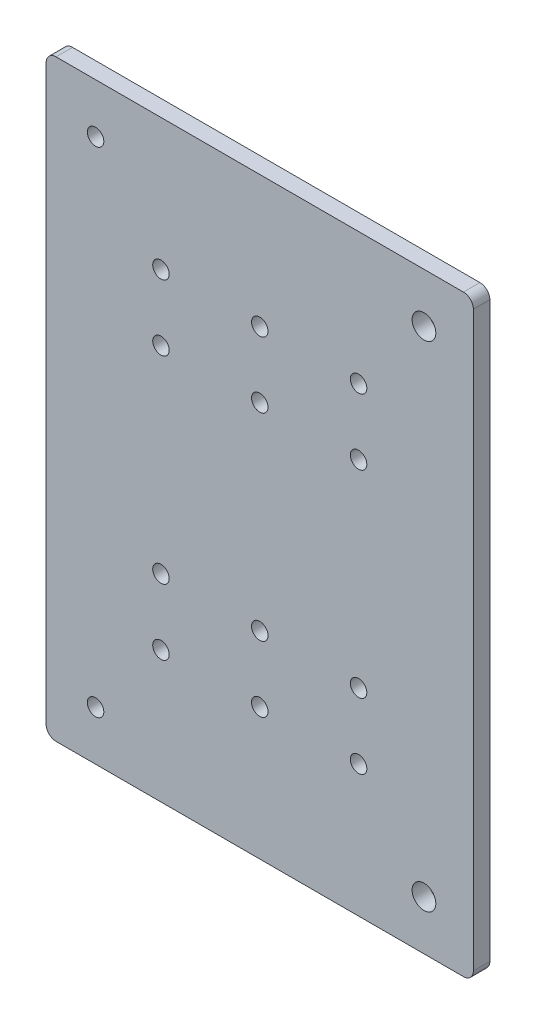
ISO-10303-21;
HEADER;
FILE_DESCRIPTION(('STEP AP214'),'2;1');
FILE_NAME('part.step','',(''),(''),'','','');
FILE_SCHEMA(('AUTOMOTIVE_DESIGN { 1 0 10303 214 1 1 1 1 }'));
ENDSEC;
DATA;
#1=APPLICATION_CONTEXT('core data for automotive mechanical design processes');
#2=APPLICATION_PROTOCOL_DEFINITION('international standard','automotive_design',2000,#1);
#3=PRODUCT_CONTEXT('',#1,'mechanical');
#4=PRODUCT('Part','Part','',(#3));
#5=PRODUCT_RELATED_PRODUCT_CATEGORY('part','',(#4));
#6=PRODUCT_DEFINITION_FORMATION('','',#4);
#7=PRODUCT_DEFINITION_CONTEXT('part definition',#1,'design');
#8=PRODUCT_DEFINITION('design','',#6,#7);
#9=PRODUCT_DEFINITION_SHAPE('','',#8);
#10=(LENGTH_UNIT() NAMED_UNIT(*) SI_UNIT(.MILLI.,.METRE.));
#11=(NAMED_UNIT(*) PLANE_ANGLE_UNIT() SI_UNIT($,.RADIAN.));
#12=(NAMED_UNIT(*) SI_UNIT($,.STERADIAN.) SOLID_ANGLE_UNIT());
#13=UNCERTAINTY_MEASURE_WITH_UNIT(LENGTH_MEASURE(1.E-05),#10,'distance_accuracy_value','');
#14=(GEOMETRIC_REPRESENTATION_CONTEXT(3) GLOBAL_UNCERTAINTY_ASSIGNED_CONTEXT((#13)) GLOBAL_UNIT_ASSIGNED_CONTEXT((#10,
#11,#12)) REPRESENTATION_CONTEXT('',''));
#15=CARTESIAN_POINT('',(0.,0.,0.));
#16=DIRECTION('',(0.,0.,1.));
#17=DIRECTION('',(1.,0.,0.));
#18=AXIS2_PLACEMENT_3D('',#15,#16,#17);
#19=CARTESIAN_POINT('',(0.,0.,5.));
#20=DIRECTION('',(0.,0.,-1.));
#21=DIRECTION('',(-1.,0.,0.));
#22=AXIS2_PLACEMENT_3D('',#19,#20,#21);
#23=PLANE('',#22);
#24=DIRECTION('',(0.,-1.,0.));
#25=VECTOR('',#24,1.);
#26=CARTESIAN_POINT('',(0.,0.,5.));
#27=LINE('',#26,#25);
#28=CARTESIAN_POINT('',(0.,177.,5.));
#29=VERTEX_POINT('',#28);
#30=CARTESIAN_POINT('',(0.,3.,5.));
#31=VERTEX_POINT('',#30);
#32=EDGE_CURVE('E155',#29,#31,#27,.T.);
#33=ORIENTED_EDGE('',*,*,#32,.T.);
#34=CARTESIAN_POINT('',(3.,3.,5.));
#35=DIRECTION('',(0.,0.,-1.));
#36=DIRECTION('',(-1.,0.,0.));
#37=AXIS2_PLACEMENT_3D('',#34,#35,#36);
#38=CIRCLE('',#37,3.);
#39=CARTESIAN_POINT('',(3.,0.,5.));
#40=VERTEX_POINT('',#39);
#41=EDGE_CURVE('E179',#31,#40,#38,.F.);
#42=ORIENTED_EDGE('',*,*,#41,.T.);
#43=DIRECTION('',(1.,0.,0.));
#44=VECTOR('',#43,1.);
#45=CARTESIAN_POINT('',(0.,0.,5.));
#46=LINE('',#45,#44);
#47=CARTESIAN_POINT('',(126.7,0.,5.));
#48=VERTEX_POINT('',#47);
#49=EDGE_CURVE('E130',#40,#48,#46,.T.);
#50=ORIENTED_EDGE('',*,*,#49,.T.);
#51=CARTESIAN_POINT('',(126.7,3.,5.));
#52=DIRECTION('',(0.,0.,-1.));
#53=DIRECTION('',(-1.,0.,0.));
#54=AXIS2_PLACEMENT_3D('',#51,#52,#53);
#55=CIRCLE('',#54,3.);
#56=CARTESIAN_POINT('',(129.7,3.,5.));
#57=VERTEX_POINT('',#56);
#58=EDGE_CURVE('E176',#48,#57,#55,.F.);
#59=ORIENTED_EDGE('',*,*,#58,.T.);
#60=DIRECTION('',(0.,1.,0.));
#61=VECTOR('',#60,1.);
#62=CARTESIAN_POINT('',(129.7,0.,5.));
#63=LINE('',#62,#61);
#64=CARTESIAN_POINT('',(129.7,177.,5.));
#65=VERTEX_POINT('',#64);
#66=EDGE_CURVE('E209',#57,#65,#63,.T.);
#67=ORIENTED_EDGE('',*,*,#66,.T.);
#68=CARTESIAN_POINT('',(126.7,177.,5.));
#69=DIRECTION('',(0.,0.,-1.));
#70=DIRECTION('',(-1.,0.,0.));
#71=AXIS2_PLACEMENT_3D('',#68,#69,#70);
#72=CIRCLE('',#71,3.);
#73=CARTESIAN_POINT('',(126.7,180.,5.));
#74=VERTEX_POINT('',#73);
#75=EDGE_CURVE('E64',#65,#74,#72,.F.);
#76=ORIENTED_EDGE('',*,*,#75,.T.);
#77=DIRECTION('',(-1.,0.,0.));
#78=VECTOR('',#77,1.);
#79=CARTESIAN_POINT('',(0.,180.,5.));
#80=LINE('',#79,#78);
#81=CARTESIAN_POINT('',(3.,180.,5.));
#82=VERTEX_POINT('',#81);
#83=EDGE_CURVE('E157',#74,#82,#80,.T.);
#84=ORIENTED_EDGE('',*,*,#83,.T.);
#85=CARTESIAN_POINT('',(3.,177.,5.));
#86=DIRECTION('',(0.,0.,-1.));
#87=DIRECTION('',(-1.,0.,0.));
#88=AXIS2_PLACEMENT_3D('',#85,#86,#87);
#89=CIRCLE('',#88,3.);
#90=EDGE_CURVE('E173',#82,#29,#89,.F.);
#91=ORIENTED_EDGE('',*,*,#90,.T.);
#92=EDGE_LOOP('',(#33,#42,#50,#59,#67,#76,#84,#91));
#93=FACE_BOUND('',#92,.T.);
#94=CARTESIAN_POINT('',(15.,15.,5.));
#95=DIRECTION('',(0.,0.,1.));
#96=DIRECTION('',(1.,0.,0.));
#97=AXIS2_PLACEMENT_3D('',#94,#95,#96);
#98=CIRCLE('',#97,2.5);
#99=CARTESIAN_POINT('',(17.5,15.,5.));
#100=VERTEX_POINT('',#99);
#101=EDGE_CURVE('E149',#100,#100,#98,.T.);
#102=ORIENTED_EDGE('',*,*,#101,.F.);
#103=EDGE_LOOP('',(#102));
#104=FACE_BOUND('',#103,.T.);
#105=CARTESIAN_POINT('',(15.,165.,5.));
#106=DIRECTION('',(0.,0.,1.));
#107=DIRECTION('',(1.,0.,0.));
#108=AXIS2_PLACEMENT_3D('',#105,#106,#107);
#109=CIRCLE('',#108,2.5);
#110=CARTESIAN_POINT('',(17.5,165.,5.));
#111=VERTEX_POINT('',#110);
#112=EDGE_CURVE('E228',#111,#111,#109,.T.);
#113=ORIENTED_EDGE('',*,*,#112,.F.);
#114=EDGE_LOOP('',(#113));
#115=FACE_BOUND('',#114,.T.);
#116=CARTESIAN_POINT('',(114.7,165.,5.));
#117=DIRECTION('',(0.,0.,1.));
#118=DIRECTION('',(1.,0.,0.));
#119=AXIS2_PLACEMENT_3D('',#116,#117,#118);
#120=CIRCLE('',#119,3.59999999999997);
#121=CARTESIAN_POINT('',(118.3,165.,5.));
#122=VERTEX_POINT('',#121);
#123=EDGE_CURVE('E232',#122,#122,#120,.T.);
#124=ORIENTED_EDGE('',*,*,#123,.F.);
#125=EDGE_LOOP('',(#124));
#126=FACE_BOUND('',#125,.T.);
#127=CARTESIAN_POINT('',(114.7,15.,5.));
#128=DIRECTION('',(0.,0.,1.));
#129=DIRECTION('',(1.,0.,0.));
#130=AXIS2_PLACEMENT_3D('',#127,#128,#129);
#131=CIRCLE('',#130,3.6);
#132=CARTESIAN_POINT('',(118.3,15.,5.));
#133=VERTEX_POINT('',#132);
#134=EDGE_CURVE('E236',#133,#133,#131,.T.);
#135=ORIENTED_EDGE('',*,*,#134,.F.);
#136=EDGE_LOOP('',(#135));
#137=FACE_BOUND('',#136,.T.);
#138=CARTESIAN_POINT('',(34.85,140.,5.));
#139=DIRECTION('',(0.,0.,1.));
#140=DIRECTION('',(1.,0.,0.));
#141=AXIS2_PLACEMENT_3D('',#138,#139,#140);
#142=CIRCLE('',#141,2.5);
#143=CARTESIAN_POINT('',(37.35,140.,5.));
#144=VERTEX_POINT('',#143);
#145=EDGE_CURVE('E240',#144,#144,#142,.T.);
#146=ORIENTED_EDGE('',*,*,#145,.F.);
#147=EDGE_LOOP('',(#146));
#148=FACE_BOUND('',#147,.T.);
#149=CARTESIAN_POINT('',(64.85,140.,5.));
#150=DIRECTION('',(0.,0.,1.));
#151=DIRECTION('',(1.,0.,0.));
#152=AXIS2_PLACEMENT_3D('',#149,#150,#151);
#153=CIRCLE('',#152,2.5);
#154=CARTESIAN_POINT('',(67.35,140.,5.));
#155=VERTEX_POINT('',#154);
#156=EDGE_CURVE('E244',#155,#155,#153,.T.);
#157=ORIENTED_EDGE('',*,*,#156,.F.);
#158=EDGE_LOOP('',(#157));
#159=FACE_BOUND('',#158,.T.);
#160=CARTESIAN_POINT('',(94.85,140.,5.));
#161=DIRECTION('',(0.,0.,1.));
#162=DIRECTION('',(1.,0.,0.));
#163=AXIS2_PLACEMENT_3D('',#160,#161,#162);
#164=CIRCLE('',#163,2.5);
#165=CARTESIAN_POINT('',(97.35,140.,5.));
#166=VERTEX_POINT('',#165);
#167=EDGE_CURVE('E248',#166,#166,#164,.T.);
#168=ORIENTED_EDGE('',*,*,#167,.F.);
#169=EDGE_LOOP('',(#168));
#170=FACE_BOUND('',#169,.T.);
#171=CARTESIAN_POINT('',(34.85,40.,5.));
#172=DIRECTION('',(0.,0.,1.));
#173=DIRECTION('',(1.,0.,0.));
#174=AXIS2_PLACEMENT_3D('',#171,#172,#173);
#175=CIRCLE('',#174,2.5);
#176=CARTESIAN_POINT('',(37.35,40.,5.));
#177=VERTEX_POINT('',#176);
#178=EDGE_CURVE('E252',#177,#177,#175,.T.);
#179=ORIENTED_EDGE('',*,*,#178,.F.);
#180=EDGE_LOOP('',(#179));
#181=FACE_BOUND('',#180,.T.);
#182=CARTESIAN_POINT('',(64.85,40.,5.));
#183=DIRECTION('',(0.,0.,1.));
#184=DIRECTION('',(1.,0.,0.));
#185=AXIS2_PLACEMENT_3D('',#182,#183,#184);
#186=CIRCLE('',#185,2.5);
#187=CARTESIAN_POINT('',(67.35,40.,5.));
#188=VERTEX_POINT('',#187);
#189=EDGE_CURVE('E256',#188,#188,#186,.T.);
#190=ORIENTED_EDGE('',*,*,#189,.F.);
#191=EDGE_LOOP('',(#190));
#192=FACE_BOUND('',#191,.T.);
#193=CARTESIAN_POINT('',(94.85,40.,5.));
#194=DIRECTION('',(0.,0.,1.));
#195=DIRECTION('',(1.,0.,0.));
#196=AXIS2_PLACEMENT_3D('',#193,#194,#195);
#197=CIRCLE('',#196,2.5);
#198=CARTESIAN_POINT('',(97.35,40.,5.));
#199=VERTEX_POINT('',#198);
#200=EDGE_CURVE('E260',#199,#199,#197,.T.);
#201=ORIENTED_EDGE('',*,*,#200,.F.);
#202=EDGE_LOOP('',(#201));
#203=FACE_BOUND('',#202,.T.);
#204=CARTESIAN_POINT('',(94.85,120.,5.));
#205=DIRECTION('',(0.,0.,1.));
#206=DIRECTION('',(1.,0.,0.));
#207=AXIS2_PLACEMENT_3D('',#204,#205,#206);
#208=CIRCLE('',#207,2.5);
#209=CARTESIAN_POINT('',(97.35,120.,5.));
#210=VERTEX_POINT('',#209);
#211=EDGE_CURVE('E264',#210,#210,#208,.T.);
#212=ORIENTED_EDGE('',*,*,#211,.F.);
#213=EDGE_LOOP('',(#212));
#214=FACE_BOUND('',#213,.T.);
#215=CARTESIAN_POINT('',(64.85,120.,5.));
#216=DIRECTION('',(0.,0.,1.));
#217=DIRECTION('',(1.,0.,0.));
#218=AXIS2_PLACEMENT_3D('',#215,#216,#217);
#219=CIRCLE('',#218,2.5);
#220=CARTESIAN_POINT('',(67.35,120.,5.));
#221=VERTEX_POINT('',#220);
#222=EDGE_CURVE('E268',#221,#221,#219,.T.);
#223=ORIENTED_EDGE('',*,*,#222,.F.);
#224=EDGE_LOOP('',(#223));
#225=FACE_BOUND('',#224,.T.);
#226=CARTESIAN_POINT('',(34.85,120.,5.));
#227=DIRECTION('',(0.,0.,1.));
#228=DIRECTION('',(1.,0.,0.));
#229=AXIS2_PLACEMENT_3D('',#226,#227,#228);
#230=CIRCLE('',#229,2.5);
#231=CARTESIAN_POINT('',(37.35,120.,5.));
#232=VERTEX_POINT('',#231);
#233=EDGE_CURVE('E272',#232,#232,#230,.T.);
#234=ORIENTED_EDGE('',*,*,#233,.F.);
#235=EDGE_LOOP('',(#234));
#236=FACE_BOUND('',#235,.T.);
#237=CARTESIAN_POINT('',(34.85,60.,5.));
#238=DIRECTION('',(0.,0.,1.));
#239=DIRECTION('',(1.,0.,0.));
#240=AXIS2_PLACEMENT_3D('',#237,#238,#239);
#241=CIRCLE('',#240,2.5);
#242=CARTESIAN_POINT('',(37.35,60.,5.));
#243=VERTEX_POINT('',#242);
#244=EDGE_CURVE('E276',#243,#243,#241,.T.);
#245=ORIENTED_EDGE('',*,*,#244,.F.);
#246=EDGE_LOOP('',(#245));
#247=FACE_BOUND('',#246,.T.);
#248=CARTESIAN_POINT('',(64.85,60.,5.));
#249=DIRECTION('',(0.,0.,1.));
#250=DIRECTION('',(1.,0.,0.));
#251=AXIS2_PLACEMENT_3D('',#248,#249,#250);
#252=CIRCLE('',#251,2.5);
#253=CARTESIAN_POINT('',(67.35,60.,5.));
#254=VERTEX_POINT('',#253);
#255=EDGE_CURVE('E280',#254,#254,#252,.T.);
#256=ORIENTED_EDGE('',*,*,#255,.F.);
#257=EDGE_LOOP('',(#256));
#258=FACE_BOUND('',#257,.T.);
#259=CARTESIAN_POINT('',(94.85,60.,5.));
#260=DIRECTION('',(0.,0.,1.));
#261=DIRECTION('',(1.,0.,0.));
#262=AXIS2_PLACEMENT_3D('',#259,#260,#261);
#263=CIRCLE('',#262,2.5);
#264=CARTESIAN_POINT('',(97.35,60.,5.));
#265=VERTEX_POINT('',#264);
#266=EDGE_CURVE('E283',#265,#265,#263,.T.);
#267=ORIENTED_EDGE('',*,*,#266,.F.);
#268=EDGE_LOOP('',(#267));
#269=FACE_BOUND('',#268,.T.);
#270=ADVANCED_FACE('F43',(#93,#104,#115,#126,#137,#148,#159,#170,#181,#192,#203,#214,#225,#236,
#247,#258,#269),#23,.F.);
#271=CARTESIAN_POINT('',(0.,0.,0.));
#272=DIRECTION('',(0.,0.,-1.));
#273=DIRECTION('',(-1.,0.,0.));
#274=AXIS2_PLACEMENT_3D('',#271,#272,#273);
#275=PLANE('',#274);
#276=CARTESIAN_POINT('',(64.85,60.,0.));
#277=DIRECTION('',(0.,0.,1.));
#278=DIRECTION('',(1.,0.,0.));
#279=AXIS2_PLACEMENT_3D('',#276,#277,#278);
#280=CIRCLE('',#279,2.5);
#281=CARTESIAN_POINT('',(67.35,60.,0.));
#282=VERTEX_POINT('',#281);
#283=EDGE_CURVE('E286',#282,#282,#280,.T.);
#284=ORIENTED_EDGE('',*,*,#283,.T.);
#285=EDGE_LOOP('',(#284));
#286=FACE_BOUND('',#285,.T.);
#287=CARTESIAN_POINT('',(34.85,120.,0.));
#288=DIRECTION('',(0.,0.,1.));
#289=DIRECTION('',(1.,0.,0.));
#290=AXIS2_PLACEMENT_3D('',#287,#288,#289);
#291=CIRCLE('',#290,2.5);
#292=CARTESIAN_POINT('',(37.35,120.,0.));
#293=VERTEX_POINT('',#292);
#294=EDGE_CURVE('E303',#293,#293,#291,.T.);
#295=ORIENTED_EDGE('',*,*,#294,.T.);
#296=EDGE_LOOP('',(#295));
#297=FACE_BOUND('',#296,.T.);
#298=CARTESIAN_POINT('',(94.85,120.,0.));
#299=DIRECTION('',(0.,0.,1.));
#300=DIRECTION('',(1.,0.,0.));
#301=AXIS2_PLACEMENT_3D('',#298,#299,#300);
#302=CIRCLE('',#301,2.5);
#303=CARTESIAN_POINT('',(97.35,120.,0.));
#304=VERTEX_POINT('',#303);
#305=EDGE_CURVE('E315',#304,#304,#302,.T.);
#306=ORIENTED_EDGE('',*,*,#305,.T.);
#307=EDGE_LOOP('',(#306));
#308=FACE_BOUND('',#307,.T.);
#309=CARTESIAN_POINT('',(64.85,40.,0.));
#310=DIRECTION('',(0.,0.,1.));
#311=DIRECTION('',(1.,0.,0.));
#312=AXIS2_PLACEMENT_3D('',#309,#310,#311);
#313=CIRCLE('',#312,2.5);
#314=CARTESIAN_POINT('',(67.35,40.,0.));
#315=VERTEX_POINT('',#314);
#316=EDGE_CURVE('E327',#315,#315,#313,.T.);
#317=ORIENTED_EDGE('',*,*,#316,.T.);
#318=EDGE_LOOP('',(#317));
#319=FACE_BOUND('',#318,.T.);
#320=CARTESIAN_POINT('',(94.85,140.,0.));
#321=DIRECTION('',(0.,0.,1.));
#322=DIRECTION('',(1.,0.,0.));
#323=AXIS2_PLACEMENT_3D('',#320,#321,#322);
#324=CIRCLE('',#323,2.5);
#325=CARTESIAN_POINT('',(97.35,140.,0.));
#326=VERTEX_POINT('',#325);
#327=EDGE_CURVE('E339',#326,#326,#324,.T.);
#328=ORIENTED_EDGE('',*,*,#327,.T.);
#329=EDGE_LOOP('',(#328));
#330=FACE_BOUND('',#329,.T.);
#331=CARTESIAN_POINT('',(34.85,140.,0.));
#332=DIRECTION('',(0.,0.,1.));
#333=DIRECTION('',(1.,0.,0.));
#334=AXIS2_PLACEMENT_3D('',#331,#332,#333);
#335=CIRCLE('',#334,2.5);
#336=CARTESIAN_POINT('',(37.35,140.,0.));
#337=VERTEX_POINT('',#336);
#338=EDGE_CURVE('E351',#337,#337,#335,.T.);
#339=ORIENTED_EDGE('',*,*,#338,.T.);
#340=EDGE_LOOP('',(#339));
#341=FACE_BOUND('',#340,.T.);
#342=CARTESIAN_POINT('',(114.7,165.,0.));
#343=DIRECTION('',(0.,0.,1.));
#344=DIRECTION('',(1.,0.,0.));
#345=AXIS2_PLACEMENT_3D('',#342,#343,#344);
#346=CIRCLE('',#345,3.59999999999997);
#347=CARTESIAN_POINT('',(118.3,165.,0.));
#348=VERTEX_POINT('',#347);
#349=EDGE_CURVE('E363',#348,#348,#346,.T.);
#350=ORIENTED_EDGE('',*,*,#349,.T.);
#351=EDGE_LOOP('',(#350));
#352=FACE_BOUND('',#351,.T.);
#353=CARTESIAN_POINT('',(15.,15.,0.));
#354=DIRECTION('',(0.,0.,1.));
#355=DIRECTION('',(1.,0.,0.));
#356=AXIS2_PLACEMENT_3D('',#353,#354,#355);
#357=CIRCLE('',#356,2.5);
#358=CARTESIAN_POINT('',(17.5,15.,0.));
#359=VERTEX_POINT('',#358);
#360=EDGE_CURVE('E212',#359,#359,#357,.T.);
#361=ORIENTED_EDGE('',*,*,#360,.T.);
#362=EDGE_LOOP('',(#361));
#363=FACE_BOUND('',#362,.T.);
#364=DIRECTION('',(1.,0.,0.));
#365=VECTOR('',#364,1.);
#366=CARTESIAN_POINT('',(0.,0.,0.));
#367=LINE('',#366,#365);
#368=CARTESIAN_POINT('',(3.,0.,0.));
#369=VERTEX_POINT('',#368);
#370=CARTESIAN_POINT('',(126.7,0.,0.));
#371=VERTEX_POINT('',#370);
#372=EDGE_CURVE('E127',#369,#371,#367,.T.);
#373=ORIENTED_EDGE('',*,*,#372,.F.);
#374=CARTESIAN_POINT('',(3.,3.,0.));
#375=DIRECTION('',(0.,0.,-1.));
#376=DIRECTION('',(-1.,0.,0.));
#377=AXIS2_PLACEMENT_3D('',#374,#375,#376);
#378=CIRCLE('',#377,3.);
#379=CARTESIAN_POINT('',(0.,3.,0.));
#380=VERTEX_POINT('',#379);
#381=EDGE_CURVE('E109',#369,#380,#378,.T.);
#382=ORIENTED_EDGE('',*,*,#381,.T.);
#383=DIRECTION('',(0.,-1.,0.));
#384=VECTOR('',#383,1.);
#385=CARTESIAN_POINT('',(0.,0.,0.));
#386=LINE('',#385,#384);
#387=CARTESIAN_POINT('',(0.,177.,0.));
#388=VERTEX_POINT('',#387);
#389=EDGE_CURVE('E140',#388,#380,#386,.T.);
#390=ORIENTED_EDGE('',*,*,#389,.F.);
#391=CARTESIAN_POINT('',(3.,177.,0.));
#392=DIRECTION('',(0.,0.,-1.));
#393=DIRECTION('',(-1.,0.,0.));
#394=AXIS2_PLACEMENT_3D('',#391,#392,#393);
#395=CIRCLE('',#394,3.);
#396=CARTESIAN_POINT('',(3.,180.,0.));
#397=VERTEX_POINT('',#396);
#398=EDGE_CURVE('E161',#388,#397,#395,.T.);
#399=ORIENTED_EDGE('',*,*,#398,.T.);
#400=DIRECTION('',(-1.,0.,0.));
#401=VECTOR('',#400,1.);
#402=CARTESIAN_POINT('',(0.,180.,0.));
#403=LINE('',#402,#401);
#404=CARTESIAN_POINT('',(126.7,180.,0.));
#405=VERTEX_POINT('',#404);
#406=EDGE_CURVE('E147',#405,#397,#403,.T.);
#407=ORIENTED_EDGE('',*,*,#406,.F.);
#408=CARTESIAN_POINT('',(126.7,177.,0.));
#409=DIRECTION('',(0.,0.,-1.));
#410=DIRECTION('',(-1.,0.,0.));
#411=AXIS2_PLACEMENT_3D('',#408,#409,#410);
#412=CIRCLE('',#411,3.);
#413=CARTESIAN_POINT('',(129.7,177.,0.));
#414=VERTEX_POINT('',#413);
#415=EDGE_CURVE('E132',#405,#414,#412,.T.);
#416=ORIENTED_EDGE('',*,*,#415,.T.);
#417=DIRECTION('',(0.,1.,0.));
#418=VECTOR('',#417,1.);
#419=CARTESIAN_POINT('',(129.7,0.,0.));
#420=LINE('',#419,#418);
#421=CARTESIAN_POINT('',(129.7,3.,0.));
#422=VERTEX_POINT('',#421);
#423=EDGE_CURVE('E139',#422,#414,#420,.T.);
#424=ORIENTED_EDGE('',*,*,#423,.F.);
#425=CARTESIAN_POINT('',(126.7,3.,0.));
#426=DIRECTION('',(0.,0.,-1.));
#427=DIRECTION('',(-1.,0.,0.));
#428=AXIS2_PLACEMENT_3D('',#425,#426,#427);
#429=CIRCLE('',#428,3.);
#430=EDGE_CURVE('E121',#422,#371,#429,.T.);
#431=ORIENTED_EDGE('',*,*,#430,.T.);
#432=EDGE_LOOP('',(#373,#382,#390,#399,#407,#416,#424,#431));
#433=FACE_BOUND('',#432,.T.);
#434=CARTESIAN_POINT('',(15.,165.,0.));
#435=DIRECTION('',(0.,0.,1.));
#436=DIRECTION('',(1.,0.,0.));
#437=AXIS2_PLACEMENT_3D('',#434,#435,#436);
#438=CIRCLE('',#437,2.5);
#439=CARTESIAN_POINT('',(17.5,165.,0.));
#440=VERTEX_POINT('',#439);
#441=EDGE_CURVE('E369',#440,#440,#438,.T.);
#442=ORIENTED_EDGE('',*,*,#441,.T.);
#443=EDGE_LOOP('',(#442));
#444=FACE_BOUND('',#443,.T.);
#445=CARTESIAN_POINT('',(114.7,15.,0.));
#446=DIRECTION('',(0.,0.,1.));
#447=DIRECTION('',(1.,0.,0.));
#448=AXIS2_PLACEMENT_3D('',#445,#446,#447);
#449=CIRCLE('',#448,3.6);
#450=CARTESIAN_POINT('',(118.3,15.,0.));
#451=VERTEX_POINT('',#450);
#452=EDGE_CURVE('E357',#451,#451,#449,.T.);
#453=ORIENTED_EDGE('',*,*,#452,.T.);
#454=EDGE_LOOP('',(#453));
#455=FACE_BOUND('',#454,.T.);
#456=CARTESIAN_POINT('',(64.85,140.,0.));
#457=DIRECTION('',(0.,0.,1.));
#458=DIRECTION('',(1.,0.,0.));
#459=AXIS2_PLACEMENT_3D('',#456,#457,#458);
#460=CIRCLE('',#459,2.5);
#461=CARTESIAN_POINT('',(67.35,140.,0.));
#462=VERTEX_POINT('',#461);
#463=EDGE_CURVE('E345',#462,#462,#460,.T.);
#464=ORIENTED_EDGE('',*,*,#463,.T.);
#465=EDGE_LOOP('',(#464));
#466=FACE_BOUND('',#465,.T.);
#467=CARTESIAN_POINT('',(34.85,40.,0.));
#468=DIRECTION('',(0.,0.,1.));
#469=DIRECTION('',(1.,0.,0.));
#470=AXIS2_PLACEMENT_3D('',#467,#468,#469);
#471=CIRCLE('',#470,2.5);
#472=CARTESIAN_POINT('',(37.35,40.,0.));
#473=VERTEX_POINT('',#472);
#474=EDGE_CURVE('E333',#473,#473,#471,.T.);
#475=ORIENTED_EDGE('',*,*,#474,.T.);
#476=EDGE_LOOP('',(#475));
#477=FACE_BOUND('',#476,.T.);
#478=CARTESIAN_POINT('',(94.85,40.,0.));
#479=DIRECTION('',(0.,0.,1.));
#480=DIRECTION('',(1.,0.,0.));
#481=AXIS2_PLACEMENT_3D('',#478,#479,#480);
#482=CIRCLE('',#481,2.5);
#483=CARTESIAN_POINT('',(97.35,40.,0.));
#484=VERTEX_POINT('',#483);
#485=EDGE_CURVE('E321',#484,#484,#482,.T.);
#486=ORIENTED_EDGE('',*,*,#485,.T.);
#487=EDGE_LOOP('',(#486));
#488=FACE_BOUND('',#487,.T.);
#489=CARTESIAN_POINT('',(64.85,120.,0.));
#490=DIRECTION('',(0.,0.,1.));
#491=DIRECTION('',(1.,0.,0.));
#492=AXIS2_PLACEMENT_3D('',#489,#490,#491);
#493=CIRCLE('',#492,2.5);
#494=CARTESIAN_POINT('',(67.35,120.,0.));
#495=VERTEX_POINT('',#494);
#496=EDGE_CURVE('E309',#495,#495,#493,.T.);
#497=ORIENTED_EDGE('',*,*,#496,.T.);
#498=EDGE_LOOP('',(#497));
#499=FACE_BOUND('',#498,.T.);
#500=CARTESIAN_POINT('',(34.85,60.,0.));
#501=DIRECTION('',(0.,0.,1.));
#502=DIRECTION('',(1.,0.,0.));
#503=AXIS2_PLACEMENT_3D('',#500,#501,#502);
#504=CIRCLE('',#503,2.5);
#505=CARTESIAN_POINT('',(37.35,60.,0.));
#506=VERTEX_POINT('',#505);
#507=EDGE_CURVE('E299',#506,#506,#504,.T.);
#508=ORIENTED_EDGE('',*,*,#507,.T.);
#509=EDGE_LOOP('',(#508));
#510=FACE_BOUND('',#509,.T.);
#511=CARTESIAN_POINT('',(94.85,60.,0.));
#512=DIRECTION('',(0.,0.,1.));
#513=DIRECTION('',(1.,0.,0.));
#514=AXIS2_PLACEMENT_3D('',#511,#512,#513);
#515=CIRCLE('',#514,2.5);
#516=CARTESIAN_POINT('',(97.35,60.,0.));
#517=VERTEX_POINT('',#516);
#518=EDGE_CURVE('E287',#517,#517,#515,.T.);
#519=ORIENTED_EDGE('',*,*,#518,.T.);
#520=EDGE_LOOP('',(#519));
#521=FACE_BOUND('',#520,.T.);
#522=ADVANCED_FACE('F135',(#286,#297,#308,#319,#330,#341,#352,#363,#433,#444,#455,#466,#477,
#488,#499,#510,#521),#275,.T.);
#523=CARTESIAN_POINT('',(0.,0.,5.));
#524=DIRECTION('',(1.,0.,0.));
#525=DIRECTION('',(0.,0.,-1.));
#526=AXIS2_PLACEMENT_3D('',#523,#524,#525);
#527=PLANE('',#526);
#528=ORIENTED_EDGE('',*,*,#389,.T.);
#529=DIRECTION('',(0.,0.,-1.));
#530=VECTOR('',#529,1.);
#531=CARTESIAN_POINT('',(0.,3.,5.));
#532=LINE('',#531,#530);
#533=EDGE_CURVE('E114',#380,#31,#532,.F.);
#534=ORIENTED_EDGE('',*,*,#533,.T.);
#535=ORIENTED_EDGE('',*,*,#32,.F.);
#536=DIRECTION('',(0.,0.,-1.));
#537=VECTOR('',#536,1.);
#538=CARTESIAN_POINT('',(0.,177.,5.));
#539=LINE('',#538,#537);
#540=EDGE_CURVE('E120',#29,#388,#539,.T.);
#541=ORIENTED_EDGE('',*,*,#540,.T.);
#542=EDGE_LOOP('',(#528,#534,#535,#541));
#543=FACE_BOUND('',#542,.T.);
#544=ADVANCED_FACE('F202',(#543),#527,.F.);
#545=CARTESIAN_POINT('',(0.,0.,5.));
#546=DIRECTION('',(0.,1.,0.));
#547=DIRECTION('',(0.,0.,1.));
#548=AXIS2_PLACEMENT_3D('',#545,#546,#547);
#549=PLANE('',#548);
#550=ORIENTED_EDGE('',*,*,#49,.F.);
#551=DIRECTION('',(0.,0.,-1.));
#552=VECTOR('',#551,1.);
#553=CARTESIAN_POINT('',(3.,0.,5.));
#554=LINE('',#553,#552);
#555=EDGE_CURVE('E113',#40,#369,#554,.T.);
#556=ORIENTED_EDGE('',*,*,#555,.T.);
#557=ORIENTED_EDGE('',*,*,#372,.T.);
#558=DIRECTION('',(0.,0.,-1.));
#559=VECTOR('',#558,1.);
#560=CARTESIAN_POINT('',(126.7,0.,5.));
#561=LINE('',#560,#559);
#562=EDGE_CURVE('E133',#371,#48,#561,.F.);
#563=ORIENTED_EDGE('',*,*,#562,.T.);
#564=EDGE_LOOP('',(#550,#556,#557,#563));
#565=FACE_BOUND('',#564,.T.);
#566=ADVANCED_FACE('F126',(#565),#549,.F.);
#567=CARTESIAN_POINT('',(129.7,0.,5.));
#568=DIRECTION('',(-1.,0.,0.));
#569=DIRECTION('',(0.,0.,1.));
#570=AXIS2_PLACEMENT_3D('',#567,#568,#569);
#571=PLANE('',#570);
#572=ORIENTED_EDGE('',*,*,#66,.F.);
#573=DIRECTION('',(0.,0.,-1.));
#574=VECTOR('',#573,1.);
#575=CARTESIAN_POINT('',(129.7,3.,5.));
#576=LINE('',#575,#574);
#577=EDGE_CURVE('E185',#57,#422,#576,.T.);
#578=ORIENTED_EDGE('',*,*,#577,.T.);
#579=ORIENTED_EDGE('',*,*,#423,.T.);
#580=DIRECTION('',(0.,0.,-1.));
#581=VECTOR('',#580,1.);
#582=CARTESIAN_POINT('',(129.7,177.,5.));
#583=LINE('',#582,#581);
#584=EDGE_CURVE('E182',#414,#65,#583,.F.);
#585=ORIENTED_EDGE('',*,*,#584,.T.);
#586=EDGE_LOOP('',(#572,#578,#579,#585));
#587=FACE_BOUND('',#586,.T.);
#588=ADVANCED_FACE('F399',(#587),#571,.F.);
#589=CARTESIAN_POINT('',(0.,180.,5.));
#590=DIRECTION('',(0.,-1.,0.));
#591=DIRECTION('',(0.,0.,-1.));
#592=AXIS2_PLACEMENT_3D('',#589,#590,#591);
#593=PLANE('',#592);
#594=ORIENTED_EDGE('',*,*,#406,.T.);
#595=DIRECTION('',(0.,0.,-1.));
#596=VECTOR('',#595,1.);
#597=CARTESIAN_POINT('',(3.,180.,5.));
#598=LINE('',#597,#596);
#599=EDGE_CURVE('E11',#397,#82,#598,.F.);
#600=ORIENTED_EDGE('',*,*,#599,.T.);
#601=ORIENTED_EDGE('',*,*,#83,.F.);
#602=DIRECTION('',(0.,0.,-1.));
#603=VECTOR('',#602,1.);
#604=CARTESIAN_POINT('',(126.7,180.,5.));
#605=LINE('',#604,#603);
#606=EDGE_CURVE('E52',#74,#405,#605,.T.);
#607=ORIENTED_EDGE('',*,*,#606,.T.);
#608=EDGE_LOOP('',(#594,#600,#601,#607));
#609=FACE_BOUND('',#608,.T.);
#610=ADVANCED_FACE('F194',(#609),#593,.F.);
#611=CARTESIAN_POINT('',(15.,15.,5.));
#612=DIRECTION('',(0.,0.,-1.));
#613=DIRECTION('',(-1.,0.,0.));
#614=AXIS2_PLACEMENT_3D('',#611,#612,#613);
#615=CYLINDRICAL_SURFACE('',#614,2.5);
#616=ORIENTED_EDGE('',*,*,#101,.T.);
#617=EDGE_LOOP('',(#616));
#618=FACE_BOUND('',#617,.T.);
#619=ORIENTED_EDGE('',*,*,#360,.F.);
#620=EDGE_LOOP('',(#619));
#621=FACE_BOUND('',#620,.T.);
#622=ADVANCED_FACE('F388',(#618,#621),#615,.F.);
#623=CARTESIAN_POINT('',(15.,165.,5.));
#624=DIRECTION('',(0.,0.,-1.));
#625=DIRECTION('',(-1.,0.,0.));
#626=AXIS2_PLACEMENT_3D('',#623,#624,#625);
#627=CYLINDRICAL_SURFACE('',#626,2.5);
#628=ORIENTED_EDGE('',*,*,#112,.T.);
#629=EDGE_LOOP('',(#628));
#630=FACE_BOUND('',#629,.T.);
#631=ORIENTED_EDGE('',*,*,#441,.F.);
#632=EDGE_LOOP('',(#631));
#633=FACE_BOUND('',#632,.T.);
#634=ADVANCED_FACE('F390',(#630,#633),#627,.F.);
#635=CARTESIAN_POINT('',(114.7,165.,5.));
#636=DIRECTION('',(0.,0.,-1.));
#637=DIRECTION('',(-1.,0.,0.));
#638=AXIS2_PLACEMENT_3D('',#635,#636,#637);
#639=CYLINDRICAL_SURFACE('',#638,3.59999999999997);
#640=ORIENTED_EDGE('',*,*,#123,.T.);
#641=EDGE_LOOP('',(#640));
#642=FACE_BOUND('',#641,.T.);
#643=ORIENTED_EDGE('',*,*,#349,.F.);
#644=EDGE_LOOP('',(#643));
#645=FACE_BOUND('',#644,.T.);
#646=ADVANCED_FACE('F396',(#642,#645),#639,.F.);
#647=CARTESIAN_POINT('',(114.7,15.,5.));
#648=DIRECTION('',(0.,0.,-1.));
#649=DIRECTION('',(-1.,0.,0.));
#650=AXIS2_PLACEMENT_3D('',#647,#648,#649);
#651=CYLINDRICAL_SURFACE('',#650,3.6);
#652=ORIENTED_EDGE('',*,*,#134,.T.);
#653=EDGE_LOOP('',(#652));
#654=FACE_BOUND('',#653,.T.);
#655=ORIENTED_EDGE('',*,*,#452,.F.);
#656=EDGE_LOOP('',(#655));
#657=FACE_BOUND('',#656,.T.);
#658=ADVANCED_FACE('F565',(#654,#657),#651,.F.);
#659=CARTESIAN_POINT('',(34.85,140.,5.));
#660=DIRECTION('',(0.,0.,-1.));
#661=DIRECTION('',(-1.,0.,0.));
#662=AXIS2_PLACEMENT_3D('',#659,#660,#661);
#663=CYLINDRICAL_SURFACE('',#662,2.5);
#664=ORIENTED_EDGE('',*,*,#145,.T.);
#665=EDGE_LOOP('',(#664));
#666=FACE_BOUND('',#665,.T.);
#667=ORIENTED_EDGE('',*,*,#338,.F.);
#668=EDGE_LOOP('',(#667));
#669=FACE_BOUND('',#668,.T.);
#670=ADVANCED_FACE('F555',(#666,#669),#663,.F.);
#671=CARTESIAN_POINT('',(64.85,140.,5.));
#672=DIRECTION('',(0.,0.,-1.));
#673=DIRECTION('',(-1.,0.,0.));
#674=AXIS2_PLACEMENT_3D('',#671,#672,#673);
#675=CYLINDRICAL_SURFACE('',#674,2.5);
#676=ORIENTED_EDGE('',*,*,#156,.T.);
#677=EDGE_LOOP('',(#676));
#678=FACE_BOUND('',#677,.T.);
#679=ORIENTED_EDGE('',*,*,#463,.F.);
#680=EDGE_LOOP('',(#679));
#681=FACE_BOUND('',#680,.T.);
#682=ADVANCED_FACE('F545',(#678,#681),#675,.F.);
#683=CARTESIAN_POINT('',(94.85,140.,5.));
#684=DIRECTION('',(0.,0.,-1.));
#685=DIRECTION('',(-1.,0.,0.));
#686=AXIS2_PLACEMENT_3D('',#683,#684,#685);
#687=CYLINDRICAL_SURFACE('',#686,2.5);
#688=ORIENTED_EDGE('',*,*,#167,.T.);
#689=EDGE_LOOP('',(#688));
#690=FACE_BOUND('',#689,.T.);
#691=ORIENTED_EDGE('',*,*,#327,.F.);
#692=EDGE_LOOP('',(#691));
#693=FACE_BOUND('',#692,.T.);
#694=ADVANCED_FACE('F535',(#690,#693),#687,.F.);
#695=CARTESIAN_POINT('',(34.85,40.,5.));
#696=DIRECTION('',(0.,0.,-1.));
#697=DIRECTION('',(-1.,0.,0.));
#698=AXIS2_PLACEMENT_3D('',#695,#696,#697);
#699=CYLINDRICAL_SURFACE('',#698,2.5);
#700=ORIENTED_EDGE('',*,*,#178,.T.);
#701=EDGE_LOOP('',(#700));
#702=FACE_BOUND('',#701,.T.);
#703=ORIENTED_EDGE('',*,*,#474,.F.);
#704=EDGE_LOOP('',(#703));
#705=FACE_BOUND('',#704,.T.);
#706=ADVANCED_FACE('F525',(#702,#705),#699,.F.);
#707=CARTESIAN_POINT('',(64.85,40.,5.));
#708=DIRECTION('',(0.,0.,-1.));
#709=DIRECTION('',(-1.,0.,0.));
#710=AXIS2_PLACEMENT_3D('',#707,#708,#709);
#711=CYLINDRICAL_SURFACE('',#710,2.5);
#712=ORIENTED_EDGE('',*,*,#189,.T.);
#713=EDGE_LOOP('',(#712));
#714=FACE_BOUND('',#713,.T.);
#715=ORIENTED_EDGE('',*,*,#316,.F.);
#716=EDGE_LOOP('',(#715));
#717=FACE_BOUND('',#716,.T.);
#718=ADVANCED_FACE('F515',(#714,#717),#711,.F.);
#719=CARTESIAN_POINT('',(94.85,40.,5.));
#720=DIRECTION('',(0.,0.,-1.));
#721=DIRECTION('',(-1.,0.,0.));
#722=AXIS2_PLACEMENT_3D('',#719,#720,#721);
#723=CYLINDRICAL_SURFACE('',#722,2.5);
#724=ORIENTED_EDGE('',*,*,#200,.T.);
#725=EDGE_LOOP('',(#724));
#726=FACE_BOUND('',#725,.T.);
#727=ORIENTED_EDGE('',*,*,#485,.F.);
#728=EDGE_LOOP('',(#727));
#729=FACE_BOUND('',#728,.T.);
#730=ADVANCED_FACE('F505',(#726,#729),#723,.F.);
#731=CARTESIAN_POINT('',(94.85,120.,5.));
#732=DIRECTION('',(0.,0.,-1.));
#733=DIRECTION('',(-1.,0.,0.));
#734=AXIS2_PLACEMENT_3D('',#731,#732,#733);
#735=CYLINDRICAL_SURFACE('',#734,2.5);
#736=ORIENTED_EDGE('',*,*,#211,.T.);
#737=EDGE_LOOP('',(#736));
#738=FACE_BOUND('',#737,.T.);
#739=ORIENTED_EDGE('',*,*,#305,.F.);
#740=EDGE_LOOP('',(#739));
#741=FACE_BOUND('',#740,.T.);
#742=ADVANCED_FACE('F495',(#738,#741),#735,.F.);
#743=CARTESIAN_POINT('',(64.85,120.,5.));
#744=DIRECTION('',(0.,0.,-1.));
#745=DIRECTION('',(-1.,0.,0.));
#746=AXIS2_PLACEMENT_3D('',#743,#744,#745);
#747=CYLINDRICAL_SURFACE('',#746,2.5);
#748=ORIENTED_EDGE('',*,*,#222,.T.);
#749=EDGE_LOOP('',(#748));
#750=FACE_BOUND('',#749,.T.);
#751=ORIENTED_EDGE('',*,*,#496,.F.);
#752=EDGE_LOOP('',(#751));
#753=FACE_BOUND('',#752,.T.);
#754=ADVANCED_FACE('F485',(#750,#753),#747,.F.);
#755=CARTESIAN_POINT('',(34.85,120.,5.));
#756=DIRECTION('',(0.,0.,-1.));
#757=DIRECTION('',(-1.,0.,0.));
#758=AXIS2_PLACEMENT_3D('',#755,#756,#757);
#759=CYLINDRICAL_SURFACE('',#758,2.5);
#760=ORIENTED_EDGE('',*,*,#233,.T.);
#761=EDGE_LOOP('',(#760));
#762=FACE_BOUND('',#761,.T.);
#763=ORIENTED_EDGE('',*,*,#294,.F.);
#764=EDGE_LOOP('',(#763));
#765=FACE_BOUND('',#764,.T.);
#766=ADVANCED_FACE('F475',(#762,#765),#759,.F.);
#767=CARTESIAN_POINT('',(34.85,60.,5.));
#768=DIRECTION('',(0.,0.,-1.));
#769=DIRECTION('',(-1.,0.,0.));
#770=AXIS2_PLACEMENT_3D('',#767,#768,#769);
#771=CYLINDRICAL_SURFACE('',#770,2.5);
#772=ORIENTED_EDGE('',*,*,#244,.T.);
#773=EDGE_LOOP('',(#772));
#774=FACE_BOUND('',#773,.T.);
#775=ORIENTED_EDGE('',*,*,#507,.F.);
#776=EDGE_LOOP('',(#775));
#777=FACE_BOUND('',#776,.T.);
#778=ADVANCED_FACE('F465',(#774,#777),#771,.F.);
#779=CARTESIAN_POINT('',(64.85,60.,5.));
#780=DIRECTION('',(0.,0.,-1.));
#781=DIRECTION('',(-1.,0.,0.));
#782=AXIS2_PLACEMENT_3D('',#779,#780,#781);
#783=CYLINDRICAL_SURFACE('',#782,2.5);
#784=ORIENTED_EDGE('',*,*,#255,.T.);
#785=EDGE_LOOP('',(#784));
#786=FACE_BOUND('',#785,.T.);
#787=ORIENTED_EDGE('',*,*,#283,.F.);
#788=EDGE_LOOP('',(#787));
#789=FACE_BOUND('',#788,.T.);
#790=ADVANCED_FACE('F455',(#786,#789),#783,.F.);
#791=CARTESIAN_POINT('',(94.85,60.,5.));
#792=DIRECTION('',(0.,0.,-1.));
#793=DIRECTION('',(-1.,0.,0.));
#794=AXIS2_PLACEMENT_3D('',#791,#792,#793);
#795=CYLINDRICAL_SURFACE('',#794,2.5);
#796=ORIENTED_EDGE('',*,*,#266,.T.);
#797=EDGE_LOOP('',(#796));
#798=FACE_BOUND('',#797,.T.);
#799=ORIENTED_EDGE('',*,*,#518,.F.);
#800=EDGE_LOOP('',(#799));
#801=FACE_BOUND('',#800,.T.);
#802=ADVANCED_FACE('F416',(#798,#801),#795,.F.);
#803=CARTESIAN_POINT('',(3.,3.,5.));
#804=DIRECTION('',(0.,0.,-1.));
#805=DIRECTION('',(-1.,0.,0.));
#806=AXIS2_PLACEMENT_3D('',#803,#804,#805);
#807=CYLINDRICAL_SURFACE('',#806,3.);
#808=ORIENTED_EDGE('',*,*,#41,.F.);
#809=ORIENTED_EDGE('',*,*,#533,.F.);
#810=ORIENTED_EDGE('',*,*,#381,.F.);
#811=ORIENTED_EDGE('',*,*,#555,.F.);
#812=EDGE_LOOP('',(#808,#809,#810,#811));
#813=FACE_BOUND('',#812,.T.);
#814=ADVANCED_FACE('F112',(#813),#807,.T.);
#815=CARTESIAN_POINT('',(126.7,3.,5.));
#816=DIRECTION('',(0.,0.,-1.));
#817=DIRECTION('',(-1.,0.,0.));
#818=AXIS2_PLACEMENT_3D('',#815,#816,#817);
#819=CYLINDRICAL_SURFACE('',#818,3.);
#820=ORIENTED_EDGE('',*,*,#58,.F.);
#821=ORIENTED_EDGE('',*,*,#562,.F.);
#822=ORIENTED_EDGE('',*,*,#430,.F.);
#823=ORIENTED_EDGE('',*,*,#577,.F.);
#824=EDGE_LOOP('',(#820,#821,#822,#823));
#825=FACE_BOUND('',#824,.T.);
#826=ADVANCED_FACE('F415',(#825),#819,.T.);
#827=CARTESIAN_POINT('',(3.,177.,5.));
#828=DIRECTION('',(0.,0.,-1.));
#829=DIRECTION('',(-1.,0.,0.));
#830=AXIS2_PLACEMENT_3D('',#827,#828,#829);
#831=CYLINDRICAL_SURFACE('',#830,3.);
#832=ORIENTED_EDGE('',*,*,#90,.F.);
#833=ORIENTED_EDGE('',*,*,#599,.F.);
#834=ORIENTED_EDGE('',*,*,#398,.F.);
#835=ORIENTED_EDGE('',*,*,#540,.F.);
#836=EDGE_LOOP('',(#832,#833,#834,#835));
#837=FACE_BOUND('',#836,.T.);
#838=ADVANCED_FACE('F199',(#837),#831,.T.);
#839=CARTESIAN_POINT('',(126.7,177.,5.));
#840=DIRECTION('',(0.,0.,-1.));
#841=DIRECTION('',(-1.,0.,0.));
#842=AXIS2_PLACEMENT_3D('',#839,#840,#841);
#843=CYLINDRICAL_SURFACE('',#842,3.);
#844=ORIENTED_EDGE('',*,*,#75,.F.);
#845=ORIENTED_EDGE('',*,*,#584,.F.);
#846=ORIENTED_EDGE('',*,*,#415,.F.);
#847=ORIENTED_EDGE('',*,*,#606,.F.);
#848=EDGE_LOOP('',(#844,#845,#846,#847));
#849=FACE_BOUND('',#848,.T.);
#850=ADVANCED_FACE('F45',(#849),#843,.T.);
#851=CLOSED_SHELL('',(#270,#522,#544,#566,#588,#610,#622,#634,#646,#658,#670,#682,#694,#706,
#718,#730,#742,#754,#766,#778,#790,#802,#814,#826,#838,#850));
#852=MANIFOLD_SOLID_BREP('B2',#851);
#853=ADVANCED_BREP_SHAPE_REPRESENTATION('',(#18,#852),#14);
#854=SHAPE_DEFINITION_REPRESENTATION(#9,#853);
ENDSEC;
END-ISO-10303-21;
